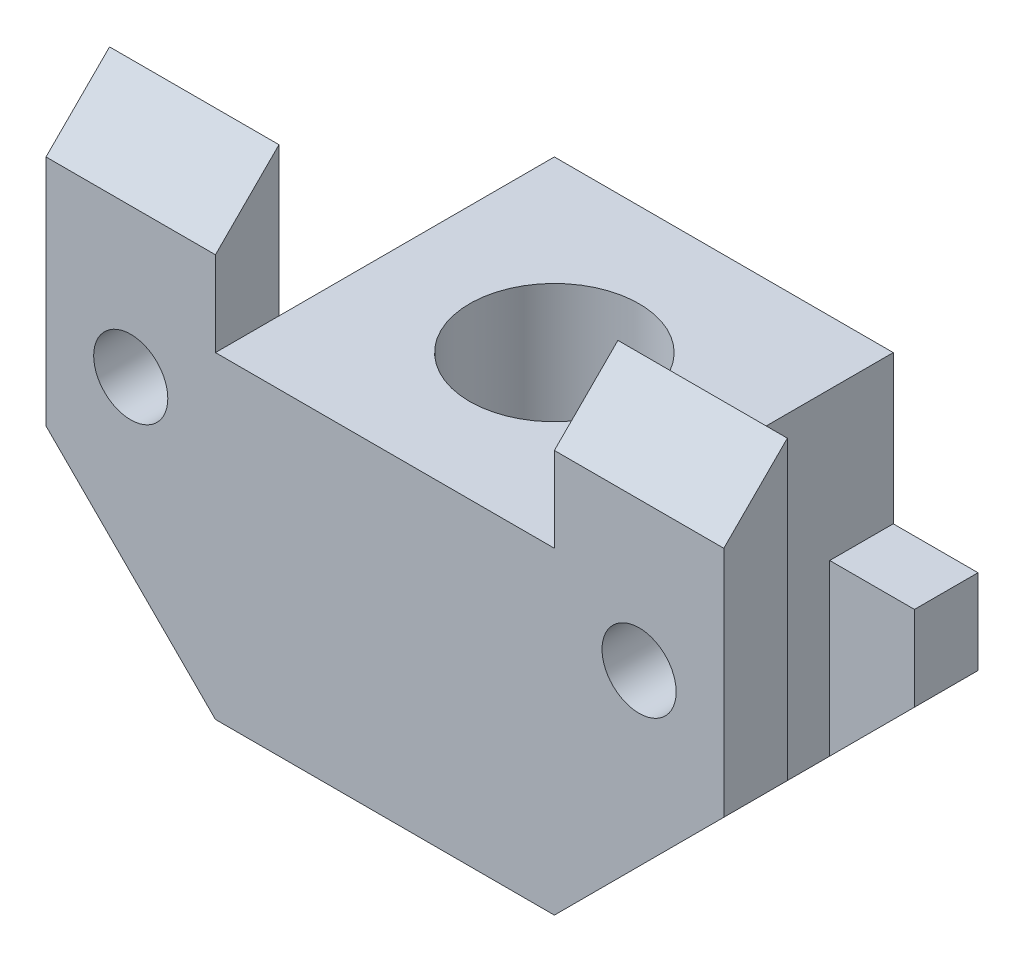
ISO-10303-21;
HEADER;
FILE_DESCRIPTION(('STEP AP214'),'2;1');
FILE_NAME('part.step','',(''),(''),'','','');
FILE_SCHEMA(('AUTOMOTIVE_DESIGN { 1 0 10303 214 1 1 1 1 }'));
ENDSEC;
DATA;
#1=APPLICATION_CONTEXT('core data for automotive mechanical design processes');
#2=APPLICATION_PROTOCOL_DEFINITION('international standard','automotive_design',2000,#1);
#3=PRODUCT_CONTEXT('',#1,'mechanical');
#4=PRODUCT('Part','Part','',(#3));
#5=PRODUCT_RELATED_PRODUCT_CATEGORY('part','',(#4));
#6=PRODUCT_DEFINITION_FORMATION('','',#4);
#7=PRODUCT_DEFINITION_CONTEXT('part definition',#1,'design');
#8=PRODUCT_DEFINITION('design','',#6,#7);
#9=PRODUCT_DEFINITION_SHAPE('','',#8);
#10=(LENGTH_UNIT() NAMED_UNIT(*) SI_UNIT(.MILLI.,.METRE.));
#11=(NAMED_UNIT(*) PLANE_ANGLE_UNIT() SI_UNIT($,.RADIAN.));
#12=(NAMED_UNIT(*) SI_UNIT($,.STERADIAN.) SOLID_ANGLE_UNIT());
#13=UNCERTAINTY_MEASURE_WITH_UNIT(LENGTH_MEASURE(1.E-05),#10,'distance_accuracy_value','');
#14=(GEOMETRIC_REPRESENTATION_CONTEXT(3) GLOBAL_UNCERTAINTY_ASSIGNED_CONTEXT((#13)) GLOBAL_UNIT_ASSIGNED_CONTEXT((#10,
#11,#12)) REPRESENTATION_CONTEXT('',''));
#15=CARTESIAN_POINT('',(0.,0.,0.));
#16=DIRECTION('',(0.,0.,1.));
#17=DIRECTION('',(1.,0.,0.));
#18=AXIS2_PLACEMENT_3D('',#15,#16,#17);
#19=CARTESIAN_POINT('',(0.,8.,0.));
#20=DIRECTION('',(0.,1.,0.));
#21=DIRECTION('',(0.,0.,1.));
#22=AXIS2_PLACEMENT_3D('',#19,#20,#21);
#23=PLANE('',#22);
#24=DIRECTION('',(1.,0.,0.));
#25=VECTOR('',#24,1.);
#26=CARTESIAN_POINT('',(16.,8.,-5.));
#27=LINE('',#26,#25);
#28=CARTESIAN_POINT('',(-12.,8.,-5.));
#29=VERTEX_POINT('',#28);
#30=CARTESIAN_POINT('',(-8.,8.,-5.));
#31=VERTEX_POINT('',#30);
#32=EDGE_CURVE('E208',#29,#31,#27,.T.);
#33=ORIENTED_EDGE('',*,*,#32,.T.);
#34=DIRECTION('',(0.,0.,1.));
#35=VECTOR('',#34,1.);
#36=CARTESIAN_POINT('',(-8.,8.,-5.));
#37=LINE('',#36,#35);
#38=CARTESIAN_POINT('',(-8.,8.,-8.));
#39=VERTEX_POINT('',#38);
#40=EDGE_CURVE('E198',#39,#31,#37,.T.);
#41=ORIENTED_EDGE('',*,*,#40,.F.);
#42=DIRECTION('',(-1.,0.,0.));
#43=VECTOR('',#42,1.);
#44=CARTESIAN_POINT('',(16.,8.,-8.));
#45=LINE('',#44,#43);
#46=CARTESIAN_POINT('',(-12.,8.,-8.));
#47=VERTEX_POINT('',#46);
#48=EDGE_CURVE('E204',#39,#47,#45,.T.);
#49=ORIENTED_EDGE('',*,*,#48,.T.);
#50=DIRECTION('',(0.,0.,-1.));
#51=VECTOR('',#50,1.);
#52=CARTESIAN_POINT('',(-12.,8.,8.001));
#53=LINE('',#52,#51);
#54=EDGE_CURVE('E212',#29,#47,#53,.T.);
#55=ORIENTED_EDGE('',*,*,#54,.F.);
#56=EDGE_LOOP('',(#33,#41,#49,#55));
#57=FACE_BOUND('',#56,.T.);
#58=ADVANCED_FACE('F41',(#57),#23,.T.);
#59=CARTESIAN_POINT('',(12.,8.,-8.));
#60=VERTEX_POINT('',#59);
#61=CARTESIAN_POINT('',(8.,8.,-8.));
#62=VERTEX_POINT('',#61);
#63=EDGE_CURVE('E180',#60,#62,#45,.T.);
#64=ORIENTED_EDGE('',*,*,#63,.T.);
#65=DIRECTION('',(0.,0.,-1.));
#66=VECTOR('',#65,1.);
#67=CARTESIAN_POINT('',(8.,8.,-5.));
#68=LINE('',#67,#66);
#69=CARTESIAN_POINT('',(8.,8.,-5.));
#70=VERTEX_POINT('',#69);
#71=EDGE_CURVE('E190',#70,#62,#68,.T.);
#72=ORIENTED_EDGE('',*,*,#71,.F.);
#73=CARTESIAN_POINT('',(12.,8.,-5.));
#74=VERTEX_POINT('',#73);
#75=EDGE_CURVE('E203',#70,#74,#27,.T.);
#76=ORIENTED_EDGE('',*,*,#75,.T.);
#77=DIRECTION('',(0.,0.,-1.));
#78=VECTOR('',#77,1.);
#79=CARTESIAN_POINT('',(12.,8.,8.001));
#80=LINE('',#79,#78);
#81=EDGE_CURVE('E201',#74,#60,#80,.T.);
#82=ORIENTED_EDGE('',*,*,#81,.T.);
#83=EDGE_LOOP('',(#64,#72,#76,#82));
#84=FACE_BOUND('',#83,.T.);
#85=ADVANCED_FACE('F200',(#84),#23,.T.);
#86=CARTESIAN_POINT('',(8.,15.,-5.));
#87=DIRECTION('',(0.,0.,-1.));
#88=DIRECTION('',(-1.,0.,0.));
#89=AXIS2_PLACEMENT_3D('',#86,#87,#88);
#90=PLANE('',#89);
#91=DIRECTION('',(0.707106781186549,0.707106781186546,0.));
#92=VECTOR('',#91,1.);
#93=CARTESIAN_POINT('',(16.,7.99999999999999,-5.));
#94=LINE('',#93,#92);
#95=CARTESIAN_POINT('',(8.,0.,-5.));
#96=VERTEX_POINT('',#95);
#97=CARTESIAN_POINT('',(12.,4.00000000000001,-5.));
#98=VERTEX_POINT('',#97);
#99=EDGE_CURVE('E352',#96,#98,#94,.T.);
#100=ORIENTED_EDGE('',*,*,#99,.T.);
#101=DIRECTION('',(0.,-1.,0.));
#102=VECTOR('',#101,1.);
#103=CARTESIAN_POINT('',(12.,4.,-5.));
#104=LINE('',#103,#102);
#105=EDGE_CURVE('E210',#74,#98,#104,.T.);
#106=ORIENTED_EDGE('',*,*,#105,.F.);
#107=ORIENTED_EDGE('',*,*,#75,.F.);
#108=DIRECTION('',(0.,-1.,0.));
#109=VECTOR('',#108,1.);
#110=CARTESIAN_POINT('',(8.,15.,-5.));
#111=LINE('',#110,#109);
#112=EDGE_CURVE('E193',#70,#96,#111,.T.);
#113=ORIENTED_EDGE('',*,*,#112,.T.);
#114=EDGE_LOOP('',(#100,#106,#107,#113));
#115=FACE_BOUND('',#114,.T.);
#116=ADVANCED_FACE('F442',(#115),#90,.F.);
#117=CARTESIAN_POINT('',(-16.,15.,-8.));
#118=DIRECTION('',(0.,0.,1.));
#119=DIRECTION('',(1.,0.,0.));
#120=AXIS2_PLACEMENT_3D('',#117,#118,#119);
#121=PLANE('',#120);
#122=ORIENTED_EDGE('',*,*,#63,.F.);
#123=DIRECTION('',(0.,1.,0.));
#124=VECTOR('',#123,1.);
#125=CARTESIAN_POINT('',(12.,4.,-8.));
#126=LINE('',#125,#124);
#127=CARTESIAN_POINT('',(12.,4.,-8.));
#128=VERTEX_POINT('',#127);
#129=EDGE_CURVE('E67',#128,#60,#126,.T.);
#130=ORIENTED_EDGE('',*,*,#129,.F.);
#131=DIRECTION('',(-0.707106781186549,-0.707106781186546,0.));
#132=VECTOR('',#131,1.);
#133=CARTESIAN_POINT('',(16.,7.99999999999999,-8.));
#134=LINE('',#133,#132);
#135=CARTESIAN_POINT('',(7.99999999999998,0.,-8.));
#136=VERTEX_POINT('',#135);
#137=EDGE_CURVE('E345',#128,#136,#134,.T.);
#138=ORIENTED_EDGE('',*,*,#137,.T.);
#139=DIRECTION('',(-1.,0.,0.));
#140=VECTOR('',#139,1.);
#141=CARTESIAN_POINT('',(-16.,0.,-8.));
#142=LINE('',#141,#140);
#143=CARTESIAN_POINT('',(-7.99999999999998,0.,-8.));
#144=VERTEX_POINT('',#143);
#145=EDGE_CURVE('E252',#136,#144,#142,.T.);
#146=ORIENTED_EDGE('',*,*,#145,.T.);
#147=DIRECTION('',(-0.707106781186549,0.707106781186546,0.));
#148=VECTOR('',#147,1.);
#149=CARTESIAN_POINT('',(-16.,7.99999999999999,-8.));
#150=LINE('',#149,#148);
#151=CARTESIAN_POINT('',(-12.,4.,-8.));
#152=VERTEX_POINT('',#151);
#153=EDGE_CURVE('E348',#144,#152,#150,.T.);
#154=ORIENTED_EDGE('',*,*,#153,.T.);
#155=DIRECTION('',(0.,-1.,0.));
#156=VECTOR('',#155,1.);
#157=CARTESIAN_POINT('',(-12.,4.,-8.));
#158=LINE('',#157,#156);
#159=EDGE_CURVE('E499',#47,#152,#158,.T.);
#160=ORIENTED_EDGE('',*,*,#159,.F.);
#161=ORIENTED_EDGE('',*,*,#48,.F.);
#162=DIRECTION('',(0.,-1.,0.));
#163=VECTOR('',#162,1.);
#164=CARTESIAN_POINT('',(-8.,31.2788205960997,-8.));
#165=LINE('',#164,#163);
#166=CARTESIAN_POINT('',(-8.,15.,-8.));
#167=VERTEX_POINT('',#166);
#168=EDGE_CURVE('E187',#167,#39,#165,.T.);
#169=ORIENTED_EDGE('',*,*,#168,.F.);
#170=DIRECTION('',(1.,0.,0.));
#171=VECTOR('',#170,1.);
#172=CARTESIAN_POINT('',(8.,15.,-8.));
#173=LINE('',#172,#171);
#174=CARTESIAN_POINT('',(8.,15.,-8.));
#175=VERTEX_POINT('',#174);
#176=EDGE_CURVE('E183',#167,#175,#173,.T.);
#177=ORIENTED_EDGE('',*,*,#176,.T.);
#178=DIRECTION('',(0.,-1.,0.));
#179=VECTOR('',#178,1.);
#180=CARTESIAN_POINT('',(8.,31.2788205960997,-8.));
#181=LINE('',#180,#179);
#182=EDGE_CURVE('E176',#175,#62,#181,.T.);
#183=ORIENTED_EDGE('',*,*,#182,.T.);
#184=EDGE_LOOP('',(#122,#130,#138,#146,#154,#160,#161,#169,#177,#183));
#185=FACE_BOUND('',#184,.T.);
#186=ADVANCED_FACE('F178',(#185),#121,.F.);
#187=CARTESIAN_POINT('',(-16.,15.,-5.));
#188=DIRECTION('',(0.,0.,-1.));
#189=DIRECTION('',(-1.,0.,0.));
#190=AXIS2_PLACEMENT_3D('',#187,#188,#189);
#191=PLANE('',#190);
#192=ORIENTED_EDGE('',*,*,#32,.F.);
#193=DIRECTION('',(0.,1.,0.));
#194=VECTOR('',#193,1.);
#195=CARTESIAN_POINT('',(-12.,4.,-5.));
#196=LINE('',#195,#194);
#197=CARTESIAN_POINT('',(-12.,4.,-5.));
#198=VERTEX_POINT('',#197);
#199=EDGE_CURVE('E59',#198,#29,#196,.T.);
#200=ORIENTED_EDGE('',*,*,#199,.F.);
#201=DIRECTION('',(0.707106781186549,-0.707106781186546,0.));
#202=VECTOR('',#201,1.);
#203=CARTESIAN_POINT('',(-16.,7.99999999999999,-5.));
#204=LINE('',#203,#202);
#205=CARTESIAN_POINT('',(-8.,0.,-5.));
#206=VERTEX_POINT('',#205);
#207=EDGE_CURVE('E342',#198,#206,#204,.T.);
#208=ORIENTED_EDGE('',*,*,#207,.T.);
#209=DIRECTION('',(0.,-1.,0.));
#210=VECTOR('',#209,1.);
#211=CARTESIAN_POINT('',(-8.,15.,-5.));
#212=LINE('',#211,#210);
#213=EDGE_CURVE('E304',#31,#206,#212,.T.);
#214=ORIENTED_EDGE('',*,*,#213,.F.);
#215=EDGE_LOOP('',(#192,#200,#208,#214));
#216=FACE_BOUND('',#215,.T.);
#217=ADVANCED_FACE('F455',(#216),#191,.F.);
#218=CARTESIAN_POINT('',(0.,15.,0.));
#219=DIRECTION('',(0.,-1.,0.));
#220=DIRECTION('',(0.,0.,-1.));
#221=AXIS2_PLACEMENT_3D('',#218,#219,#220);
#222=PLANE('',#221);
#223=CARTESIAN_POINT('',(0.,15.,0.));
#224=DIRECTION('',(0.,1.,0.));
#225=DIRECTION('',(0.,0.,1.));
#226=AXIS2_PLACEMENT_3D('',#223,#224,#225);
#227=CIRCLE('',#226,4.);
#228=CARTESIAN_POINT('',(0.,15.,4.));
#229=VERTEX_POINT('',#228);
#230=EDGE_CURVE('E248',#229,#229,#227,.T.);
#231=ORIENTED_EDGE('',*,*,#230,.F.);
#232=EDGE_LOOP('',(#231));
#233=FACE_BOUND('',#232,.T.);
#234=DIRECTION('',(0.,0.,-1.));
#235=VECTOR('',#234,1.);
#236=CARTESIAN_POINT('',(8.,15.,5.));
#237=LINE('',#236,#235);
#238=CARTESIAN_POINT('',(8.,15.,5.));
#239=VERTEX_POINT('',#238);
#240=EDGE_CURVE('E264',#239,#175,#237,.T.);
#241=ORIENTED_EDGE('',*,*,#240,.T.);
#242=ORIENTED_EDGE('',*,*,#176,.F.);
#243=DIRECTION('',(0.,0.,1.));
#244=VECTOR('',#243,1.);
#245=CARTESIAN_POINT('',(-8.,15.,5.));
#246=LINE('',#245,#244);
#247=CARTESIAN_POINT('',(-8.,15.,5.));
#248=VERTEX_POINT('',#247);
#249=EDGE_CURVE('E256',#167,#248,#246,.T.);
#250=ORIENTED_EDGE('',*,*,#249,.T.);
#251=DIRECTION('',(0.,0.,-1.));
#252=VECTOR('',#251,1.);
#253=CARTESIAN_POINT('',(-8.,15.,8.));
#254=LINE('',#253,#252);
#255=CARTESIAN_POINT('',(-8.,15.,8.));
#256=VERTEX_POINT('',#255);
#257=EDGE_CURVE('E217',#256,#248,#254,.T.);
#258=ORIENTED_EDGE('',*,*,#257,.F.);
#259=DIRECTION('',(1.,0.,0.));
#260=VECTOR('',#259,1.);
#261=CARTESIAN_POINT('',(-16.,15.,8.));
#262=LINE('',#261,#260);
#263=CARTESIAN_POINT('',(8.,15.,8.));
#264=VERTEX_POINT('',#263);
#265=EDGE_CURVE('E259',#256,#264,#262,.T.);
#266=ORIENTED_EDGE('',*,*,#265,.T.);
#267=DIRECTION('',(0.,0.,1.));
#268=VECTOR('',#267,1.);
#269=CARTESIAN_POINT('',(8.,15.,8.));
#270=LINE('',#269,#268);
#271=EDGE_CURVE('E232',#239,#264,#270,.T.);
#272=ORIENTED_EDGE('',*,*,#271,.F.);
#273=EDGE_LOOP('',(#241,#242,#250,#258,#266,#272));
#274=FACE_BOUND('',#273,.T.);
#275=ADVANCED_FACE('F391',(#233,#274),#222,.F.);
#276=CARTESIAN_POINT('',(0.,0.,0.));
#277=DIRECTION('',(0.,-1.,0.));
#278=DIRECTION('',(0.,0.,-1.));
#279=AXIS2_PLACEMENT_3D('',#276,#277,#278);
#280=PLANE('',#279);
#281=DIRECTION('',(0.,0.,-1.));
#282=VECTOR('',#281,1.);
#283=CARTESIAN_POINT('',(8.,0.,5.));
#284=LINE('',#283,#282);
#285=CARTESIAN_POINT('',(8.,0.,5.));
#286=VERTEX_POINT('',#285);
#287=EDGE_CURVE('E260',#286,#96,#284,.T.);
#288=ORIENTED_EDGE('',*,*,#287,.F.);
#289=DIRECTION('',(0.,0.,1.));
#290=VECTOR('',#289,1.);
#291=CARTESIAN_POINT('',(7.99999999999998,0.,8.));
#292=LINE('',#291,#290);
#293=CARTESIAN_POINT('',(7.99999999999998,0.,8.));
#294=VERTEX_POINT('',#293);
#295=EDGE_CURVE('E325',#286,#294,#292,.T.);
#296=ORIENTED_EDGE('',*,*,#295,.T.);
#297=DIRECTION('',(1.,0.,0.));
#298=VECTOR('',#297,1.);
#299=CARTESIAN_POINT('',(-16.,0.,8.));
#300=LINE('',#299,#298);
#301=CARTESIAN_POINT('',(-7.99999999999998,0.,8.));
#302=VERTEX_POINT('',#301);
#303=EDGE_CURVE('E274',#302,#294,#300,.T.);
#304=ORIENTED_EDGE('',*,*,#303,.F.);
#305=DIRECTION('',(0.,0.,-1.));
#306=VECTOR('',#305,1.);
#307=CARTESIAN_POINT('',(-7.99999999999998,0.,5.));
#308=LINE('',#307,#306);
#309=CARTESIAN_POINT('',(-8.,0.,5.));
#310=VERTEX_POINT('',#309);
#311=EDGE_CURVE('E322',#302,#310,#308,.T.);
#312=ORIENTED_EDGE('',*,*,#311,.T.);
#313=DIRECTION('',(0.,0.,1.));
#314=VECTOR('',#313,1.);
#315=CARTESIAN_POINT('',(-8.,0.,5.));
#316=LINE('',#315,#314);
#317=EDGE_CURVE('E270',#206,#310,#316,.T.);
#318=ORIENTED_EDGE('',*,*,#317,.F.);
#319=DIRECTION('',(0.,0.,-1.));
#320=VECTOR('',#319,1.);
#321=CARTESIAN_POINT('',(-7.99999999999998,0.,-7.99999999999999));
#322=LINE('',#321,#320);
#323=EDGE_CURVE('E319',#206,#144,#322,.T.);
#324=ORIENTED_EDGE('',*,*,#323,.T.);
#325=ORIENTED_EDGE('',*,*,#145,.F.);
#326=DIRECTION('',(0.,0.,1.));
#327=VECTOR('',#326,1.);
#328=CARTESIAN_POINT('',(7.99999999999998,0.,-4.99999999999999));
#329=LINE('',#328,#327);
#330=EDGE_CURVE('E315',#136,#96,#329,.T.);
#331=ORIENTED_EDGE('',*,*,#330,.T.);
#332=EDGE_LOOP('',(#288,#296,#304,#312,#318,#324,#325,#331));
#333=FACE_BOUND('',#332,.T.);
#334=CARTESIAN_POINT('',(0.,0.,0.));
#335=DIRECTION('',(0.,1.,0.));
#336=DIRECTION('',(0.,0.,1.));
#337=AXIS2_PLACEMENT_3D('',#334,#335,#336);
#338=CIRCLE('',#337,4.);
#339=CARTESIAN_POINT('',(0.,0.,4.));
#340=VERTEX_POINT('',#339);
#341=EDGE_CURVE('E247',#340,#340,#338,.T.);
#342=ORIENTED_EDGE('',*,*,#341,.T.);
#343=EDGE_LOOP('',(#342));
#344=FACE_BOUND('',#343,.T.);
#345=ADVANCED_FACE('F416',(#333,#344),#280,.T.);
#346=CARTESIAN_POINT('',(-8.,15.,5.));
#347=DIRECTION('',(1.,0.,0.));
#348=DIRECTION('',(0.,0.,-1.));
#349=AXIS2_PLACEMENT_3D('',#346,#347,#348);
#350=PLANE('',#349);
#351=ORIENTED_EDGE('',*,*,#317,.T.);
#352=DIRECTION('',(0.,-1.,0.));
#353=VECTOR('',#352,1.);
#354=CARTESIAN_POINT('',(-8.,15.,5.));
#355=LINE('',#354,#353);
#356=EDGE_CURVE('E300',#248,#310,#355,.T.);
#357=ORIENTED_EDGE('',*,*,#356,.F.);
#358=ORIENTED_EDGE('',*,*,#249,.F.);
#359=ORIENTED_EDGE('',*,*,#168,.T.);
#360=ORIENTED_EDGE('',*,*,#40,.T.);
#361=ORIENTED_EDGE('',*,*,#213,.T.);
#362=EDGE_LOOP('',(#351,#357,#358,#359,#360,#361));
#363=FACE_BOUND('',#362,.T.);
#364=ADVANCED_FACE('F459',(#363),#350,.F.);
#365=CARTESIAN_POINT('',(-16.,15.,5.));
#366=DIRECTION('',(0.,0.,1.));
#367=DIRECTION('',(1.,0.,0.));
#368=AXIS2_PLACEMENT_3D('',#365,#366,#367);
#369=PLANE('',#368);
#370=CARTESIAN_POINT('',(-12.,12.,5.));
#371=DIRECTION('',(0.,0.,1.));
#372=DIRECTION('',(1.,0.,0.));
#373=AXIS2_PLACEMENT_3D('',#370,#371,#372);
#374=CIRCLE('',#373,1.75);
#375=CARTESIAN_POINT('',(-10.25,12.,5.));
#376=VERTEX_POINT('',#375);
#377=EDGE_CURVE('E511',#376,#376,#374,.T.);
#378=ORIENTED_EDGE('',*,*,#377,.T.);
#379=EDGE_LOOP('',(#378));
#380=FACE_BOUND('',#379,.T.);
#381=ORIENTED_EDGE('',*,*,#356,.T.);
#382=DIRECTION('',(-0.707106781186549,0.707106781186546,0.));
#383=VECTOR('',#382,1.);
#384=CARTESIAN_POINT('',(-16.,7.99999999999999,5.));
#385=LINE('',#384,#383);
#386=CARTESIAN_POINT('',(-16.,7.99999999999999,5.));
#387=VERTEX_POINT('',#386);
#388=EDGE_CURVE('E339',#310,#387,#385,.T.);
#389=ORIENTED_EDGE('',*,*,#388,.T.);
#390=DIRECTION('',(0.,-1.,0.));
#391=VECTOR('',#390,1.);
#392=CARTESIAN_POINT('',(-16.,15.,5.));
#393=LINE('',#392,#391);
#394=CARTESIAN_POINT('',(-16.,22.,5.));
#395=VERTEX_POINT('',#394);
#396=EDGE_CURVE('E296',#395,#387,#393,.T.);
#397=ORIENTED_EDGE('',*,*,#396,.F.);
#398=DIRECTION('',(-1.,0.,0.));
#399=VECTOR('',#398,1.);
#400=CARTESIAN_POINT('',(-16.,22.,5.));
#401=LINE('',#400,#399);
#402=CARTESIAN_POINT('',(-8.,22.,5.));
#403=VERTEX_POINT('',#402);
#404=EDGE_CURVE('E218',#403,#395,#401,.T.);
#405=ORIENTED_EDGE('',*,*,#404,.F.);
#406=DIRECTION('',(0.,-1.,0.));
#407=VECTOR('',#406,1.);
#408=CARTESIAN_POINT('',(-8.,22.,5.));
#409=LINE('',#408,#407);
#410=EDGE_CURVE('E222',#403,#248,#409,.T.);
#411=ORIENTED_EDGE('',*,*,#410,.T.);
#412=EDGE_LOOP('',(#381,#389,#397,#405,#411));
#413=FACE_BOUND('',#412,.T.);
#414=ADVANCED_FACE('F407',(#380,#413),#369,.F.);
#415=CARTESIAN_POINT('',(-16.,15.,8.));
#416=DIRECTION('',(1.,0.,0.));
#417=DIRECTION('',(0.,0.,-1.));
#418=AXIS2_PLACEMENT_3D('',#415,#416,#417);
#419=PLANE('',#418);
#420=DIRECTION('',(0.,-1.,0.));
#421=VECTOR('',#420,1.);
#422=CARTESIAN_POINT('',(-16.,15.,8.));
#423=LINE('',#422,#421);
#424=CARTESIAN_POINT('',(-16.,19.,8.));
#425=VERTEX_POINT('',#424);
#426=CARTESIAN_POINT('',(-16.,7.99999999999999,8.));
#427=VERTEX_POINT('',#426);
#428=EDGE_CURVE('E293',#425,#427,#423,.T.);
#429=ORIENTED_EDGE('',*,*,#428,.F.);
#430=DIRECTION('',(0.,-0.707106781186549,0.707106781186546));
#431=VECTOR('',#430,1.);
#432=CARTESIAN_POINT('',(-16.,22.,5.));
#433=LINE('',#432,#431);
#434=EDGE_CURVE('E365',#425,#395,#433,.F.);
#435=ORIENTED_EDGE('',*,*,#434,.T.);
#436=ORIENTED_EDGE('',*,*,#396,.T.);
#437=DIRECTION('',(0.,0.,1.));
#438=VECTOR('',#437,1.);
#439=CARTESIAN_POINT('',(-16.,7.99999999999999,8.));
#440=LINE('',#439,#438);
#441=EDGE_CURVE('E335',#387,#427,#440,.T.);
#442=ORIENTED_EDGE('',*,*,#441,.T.);
#443=EDGE_LOOP('',(#429,#435,#436,#442));
#444=FACE_BOUND('',#443,.T.);
#445=ADVANCED_FACE('F404',(#444),#419,.F.);
#446=CARTESIAN_POINT('',(-16.,15.,8.));
#447=DIRECTION('',(0.,0.,-1.));
#448=DIRECTION('',(-1.,0.,0.));
#449=AXIS2_PLACEMENT_3D('',#446,#447,#448);
#450=PLANE('',#449);
#451=CARTESIAN_POINT('',(12.,12.,8.));
#452=DIRECTION('',(0.,0.,1.));
#453=DIRECTION('',(1.,0.,0.));
#454=AXIS2_PLACEMENT_3D('',#451,#452,#453);
#455=CIRCLE('',#454,1.75);
#456=CARTESIAN_POINT('',(13.75,12.,8.));
#457=VERTEX_POINT('',#456);
#458=EDGE_CURVE('E519',#457,#457,#455,.T.);
#459=ORIENTED_EDGE('',*,*,#458,.F.);
#460=EDGE_LOOP('',(#459));
#461=FACE_BOUND('',#460,.T.);
#462=CARTESIAN_POINT('',(-12.,12.,8.));
#463=DIRECTION('',(0.,0.,1.));
#464=DIRECTION('',(-1.,0.,0.));
#465=AXIS2_PLACEMENT_3D('',#462,#463,#464);
#466=CIRCLE('',#465,1.75);
#467=CARTESIAN_POINT('',(-13.75,12.,8.));
#468=VERTEX_POINT('',#467);
#469=EDGE_CURVE('E522',#468,#468,#466,.T.);
#470=ORIENTED_EDGE('',*,*,#469,.F.);
#471=EDGE_LOOP('',(#470));
#472=FACE_BOUND('',#471,.T.);
#473=DIRECTION('',(0.,-1.,0.));
#474=VECTOR('',#473,1.);
#475=CARTESIAN_POINT('',(-8.,22.,8.));
#476=LINE('',#475,#474);
#477=CARTESIAN_POINT('',(-8.,19.,8.));
#478=VERTEX_POINT('',#477);
#479=EDGE_CURVE('E229',#478,#256,#476,.T.);
#480=ORIENTED_EDGE('',*,*,#479,.F.);
#481=DIRECTION('',(-1.,0.,0.));
#482=VECTOR('',#481,1.);
#483=CARTESIAN_POINT('',(-16.,19.,8.));
#484=LINE('',#483,#482);
#485=EDGE_CURVE('E362',#478,#425,#484,.T.);
#486=ORIENTED_EDGE('',*,*,#485,.T.);
#487=ORIENTED_EDGE('',*,*,#428,.T.);
#488=DIRECTION('',(0.707106781186549,-0.707106781186546,0.));
#489=VECTOR('',#488,1.);
#490=CARTESIAN_POINT('',(-16.,7.99999999999999,8.));
#491=LINE('',#490,#489);
#492=EDGE_CURVE('E328',#427,#302,#491,.T.);
#493=ORIENTED_EDGE('',*,*,#492,.T.);
#494=ORIENTED_EDGE('',*,*,#303,.T.);
#495=DIRECTION('',(0.707106781186549,0.707106781186546,0.));
#496=VECTOR('',#495,1.);
#497=CARTESIAN_POINT('',(16.,7.99999999999999,8.));
#498=LINE('',#497,#496);
#499=CARTESIAN_POINT('',(16.,7.99999999999999,8.));
#500=VERTEX_POINT('',#499);
#501=EDGE_CURVE('E331',#294,#500,#498,.T.);
#502=ORIENTED_EDGE('',*,*,#501,.T.);
#503=DIRECTION('',(0.,-1.,0.));
#504=VECTOR('',#503,1.);
#505=CARTESIAN_POINT('',(16.,15.,8.));
#506=LINE('',#505,#504);
#507=CARTESIAN_POINT('',(16.,19.,8.));
#508=VERTEX_POINT('',#507);
#509=EDGE_CURVE('E290',#508,#500,#506,.T.);
#510=ORIENTED_EDGE('',*,*,#509,.F.);
#511=DIRECTION('',(-1.,0.,0.));
#512=VECTOR('',#511,1.);
#513=CARTESIAN_POINT('',(8.,19.,8.));
#514=LINE('',#513,#512);
#515=CARTESIAN_POINT('',(8.,19.,8.));
#516=VERTEX_POINT('',#515);
#517=EDGE_CURVE('E359',#508,#516,#514,.T.);
#518=ORIENTED_EDGE('',*,*,#517,.T.);
#519=DIRECTION('',(0.,-1.,0.));
#520=VECTOR('',#519,1.);
#521=CARTESIAN_POINT('',(8.,22.,8.));
#522=LINE('',#521,#520);
#523=EDGE_CURVE('E237',#516,#264,#522,.T.);
#524=ORIENTED_EDGE('',*,*,#523,.T.);
#525=ORIENTED_EDGE('',*,*,#265,.F.);
#526=EDGE_LOOP('',(#480,#486,#487,#493,#494,#502,#510,#518,#524,#525));
#527=FACE_BOUND('',#526,.T.);
#528=ADVANCED_FACE('F378',(#461,#472,#527),#450,.F.);
#529=CARTESIAN_POINT('',(16.,15.,8.));
#530=DIRECTION('',(-1.,0.,0.));
#531=DIRECTION('',(0.,0.,1.));
#532=AXIS2_PLACEMENT_3D('',#529,#530,#531);
#533=PLANE('',#532);
#534=DIRECTION('',(0.,-1.,0.));
#535=VECTOR('',#534,1.);
#536=CARTESIAN_POINT('',(16.,15.,5.));
#537=LINE('',#536,#535);
#538=CARTESIAN_POINT('',(16.,22.,5.));
#539=VERTEX_POINT('',#538);
#540=CARTESIAN_POINT('',(16.,7.99999999999999,5.));
#541=VERTEX_POINT('',#540);
#542=EDGE_CURVE('E286',#539,#541,#537,.T.);
#543=ORIENTED_EDGE('',*,*,#542,.F.);
#544=DIRECTION('',(0.,-0.707106781186549,0.707106781186546));
#545=VECTOR('',#544,1.);
#546=CARTESIAN_POINT('',(16.,22.,5.));
#547=LINE('',#546,#545);
#548=EDGE_CURVE('E52',#539,#508,#547,.T.);
#549=ORIENTED_EDGE('',*,*,#548,.T.);
#550=ORIENTED_EDGE('',*,*,#509,.T.);
#551=DIRECTION('',(0.,0.,-1.));
#552=VECTOR('',#551,1.);
#553=CARTESIAN_POINT('',(16.,7.99999999999999,5.));
#554=LINE('',#553,#552);
#555=EDGE_CURVE('E308',#500,#541,#554,.T.);
#556=ORIENTED_EDGE('',*,*,#555,.T.);
#557=EDGE_LOOP('',(#543,#549,#550,#556));
#558=FACE_BOUND('',#557,.T.);
#559=ADVANCED_FACE('F372',(#558),#533,.F.);
#560=CARTESIAN_POINT('',(8.,15.,5.));
#561=DIRECTION('',(0.,0.,1.));
#562=DIRECTION('',(1.,0.,0.));
#563=AXIS2_PLACEMENT_3D('',#560,#561,#562);
#564=PLANE('',#563);
#565=CARTESIAN_POINT('',(12.,12.,5.));
#566=DIRECTION('',(0.,0.,1.));
#567=DIRECTION('',(1.,0.,0.));
#568=AXIS2_PLACEMENT_3D('',#565,#566,#567);
#569=CIRCLE('',#568,1.75);
#570=CARTESIAN_POINT('',(13.75,12.,5.));
#571=VERTEX_POINT('',#570);
#572=EDGE_CURVE('E46',#571,#571,#569,.T.);
#573=ORIENTED_EDGE('',*,*,#572,.T.);
#574=EDGE_LOOP('',(#573));
#575=FACE_BOUND('',#574,.T.);
#576=ORIENTED_EDGE('',*,*,#542,.T.);
#577=DIRECTION('',(-0.707106781186549,-0.707106781186546,0.));
#578=VECTOR('',#577,1.);
#579=CARTESIAN_POINT('',(16.,7.99999999999999,5.));
#580=LINE('',#579,#578);
#581=EDGE_CURVE('E312',#541,#286,#580,.T.);
#582=ORIENTED_EDGE('',*,*,#581,.T.);
#583=DIRECTION('',(0.,-1.,0.));
#584=VECTOR('',#583,1.);
#585=CARTESIAN_POINT('',(8.,15.,5.));
#586=LINE('',#585,#584);
#587=EDGE_CURVE('E282',#239,#286,#586,.T.);
#588=ORIENTED_EDGE('',*,*,#587,.F.);
#589=DIRECTION('',(0.,-1.,0.));
#590=VECTOR('',#589,1.);
#591=CARTESIAN_POINT('',(8.,22.,5.));
#592=LINE('',#591,#590);
#593=CARTESIAN_POINT('',(8.,22.,5.));
#594=VERTEX_POINT('',#593);
#595=EDGE_CURVE('E243',#594,#239,#592,.T.);
#596=ORIENTED_EDGE('',*,*,#595,.F.);
#597=DIRECTION('',(-1.,0.,0.));
#598=VECTOR('',#597,1.);
#599=CARTESIAN_POINT('',(16.,22.,5.));
#600=LINE('',#599,#598);
#601=EDGE_CURVE('E233',#539,#594,#600,.T.);
#602=ORIENTED_EDGE('',*,*,#601,.F.);
#603=EDGE_LOOP('',(#576,#582,#588,#596,#602));
#604=FACE_BOUND('',#603,.T.);
#605=ADVANCED_FACE('F388',(#575,#604),#564,.F.);
#606=CARTESIAN_POINT('',(8.,15.,5.));
#607=DIRECTION('',(-1.,0.,0.));
#608=DIRECTION('',(0.,0.,1.));
#609=AXIS2_PLACEMENT_3D('',#606,#607,#608);
#610=PLANE('',#609);
#611=ORIENTED_EDGE('',*,*,#287,.T.);
#612=ORIENTED_EDGE('',*,*,#112,.F.);
#613=ORIENTED_EDGE('',*,*,#71,.T.);
#614=ORIENTED_EDGE('',*,*,#182,.F.);
#615=ORIENTED_EDGE('',*,*,#240,.F.);
#616=ORIENTED_EDGE('',*,*,#587,.T.);
#617=EDGE_LOOP('',(#611,#612,#613,#614,#615,#616));
#618=FACE_BOUND('',#617,.T.);
#619=ADVANCED_FACE('F192',(#618),#610,.F.);
#620=CARTESIAN_POINT('',(0.,15.,0.));
#621=DIRECTION('',(0.,-1.,0.));
#622=DIRECTION('',(0.,0.,-1.));
#623=AXIS2_PLACEMENT_3D('',#620,#621,#622);
#624=CYLINDRICAL_SURFACE('',#623,4.);
#625=ORIENTED_EDGE('',*,*,#230,.T.);
#626=EDGE_LOOP('',(#625));
#627=FACE_BOUND('',#626,.T.);
#628=ORIENTED_EDGE('',*,*,#341,.F.);
#629=EDGE_LOOP('',(#628));
#630=FACE_BOUND('',#629,.T.);
#631=ADVANCED_FACE('F423',(#627,#630),#624,.F.);
#632=CARTESIAN_POINT('',(16.,7.99999999999999,8.));
#633=DIRECTION('',(0.707106781186546,-0.707106781186549,0.));
#634=DIRECTION('',(0.,0.,1.));
#635=AXIS2_PLACEMENT_3D('',#632,#633,#634);
#636=PLANE('',#635);
#637=ORIENTED_EDGE('',*,*,#501,.F.);
#638=ORIENTED_EDGE('',*,*,#295,.F.);
#639=ORIENTED_EDGE('',*,*,#581,.F.);
#640=ORIENTED_EDGE('',*,*,#555,.F.);
#641=EDGE_LOOP('',(#637,#638,#639,#640));
#642=FACE_BOUND('',#641,.T.);
#643=ADVANCED_FACE('F421',(#642),#636,.T.);
#644=CARTESIAN_POINT('',(-16.,7.99999999999999,8.));
#645=DIRECTION('',(-0.707106781186546,-0.707106781186549,0.));
#646=DIRECTION('',(0.,0.,-1.));
#647=AXIS2_PLACEMENT_3D('',#644,#645,#646);
#648=PLANE('',#647);
#649=ORIENTED_EDGE('',*,*,#388,.F.);
#650=ORIENTED_EDGE('',*,*,#311,.F.);
#651=ORIENTED_EDGE('',*,*,#492,.F.);
#652=ORIENTED_EDGE('',*,*,#441,.F.);
#653=EDGE_LOOP('',(#649,#650,#651,#652));
#654=FACE_BOUND('',#653,.T.);
#655=ADVANCED_FACE('F412',(#654),#648,.T.);
#656=CARTESIAN_POINT('',(-16.,7.99999999999999,-8.));
#657=DIRECTION('',(-0.707106781186546,-0.707106781186549,0.));
#658=DIRECTION('',(0.,0.,-1.));
#659=AXIS2_PLACEMENT_3D('',#656,#657,#658);
#660=PLANE('',#659);
#661=DIRECTION('',(0.,0.,-1.));
#662=VECTOR('',#661,1.);
#663=CARTESIAN_POINT('',(-12.,4.,8.001));
#664=LINE('',#663,#662);
#665=EDGE_CURVE('E504',#198,#152,#664,.T.);
#666=ORIENTED_EDGE('',*,*,#665,.T.);
#667=ORIENTED_EDGE('',*,*,#153,.F.);
#668=ORIENTED_EDGE('',*,*,#323,.F.);
#669=ORIENTED_EDGE('',*,*,#207,.F.);
#670=EDGE_LOOP('',(#666,#667,#668,#669));
#671=FACE_BOUND('',#670,.T.);
#672=ADVANCED_FACE('F429',(#671),#660,.T.);
#673=CARTESIAN_POINT('',(16.,7.99999999999999,-8.));
#674=DIRECTION('',(0.707106781186546,-0.707106781186549,0.));
#675=DIRECTION('',(0.,0.,1.));
#676=AXIS2_PLACEMENT_3D('',#673,#674,#675);
#677=PLANE('',#676);
#678=DIRECTION('',(0.,0.,-1.));
#679=VECTOR('',#678,1.);
#680=CARTESIAN_POINT('',(12.,4.,8.001));
#681=LINE('',#680,#679);
#682=EDGE_CURVE('E493',#98,#128,#681,.T.);
#683=ORIENTED_EDGE('',*,*,#682,.F.);
#684=ORIENTED_EDGE('',*,*,#99,.F.);
#685=ORIENTED_EDGE('',*,*,#330,.F.);
#686=ORIENTED_EDGE('',*,*,#137,.F.);
#687=EDGE_LOOP('',(#683,#684,#685,#686));
#688=FACE_BOUND('',#687,.T.);
#689=ADVANCED_FACE('F451',(#688),#677,.T.);
#690=CARTESIAN_POINT('',(8.,22.,8.));
#691=DIRECTION('',(1.,0.,0.));
#692=DIRECTION('',(0.,0.,-1.));
#693=AXIS2_PLACEMENT_3D('',#690,#691,#692);
#694=PLANE('',#693);
#695=ORIENTED_EDGE('',*,*,#523,.F.);
#696=DIRECTION('',(0.,0.707106781186549,-0.707106781186546));
#697=VECTOR('',#696,1.);
#698=CARTESIAN_POINT('',(8.,22.,5.));
#699=LINE('',#698,#697);
#700=EDGE_CURVE('E11',#516,#594,#699,.T.);
#701=ORIENTED_EDGE('',*,*,#700,.T.);
#702=ORIENTED_EDGE('',*,*,#595,.T.);
#703=ORIENTED_EDGE('',*,*,#271,.T.);
#704=EDGE_LOOP('',(#695,#701,#702,#703));
#705=FACE_BOUND('',#704,.T.);
#706=ADVANCED_FACE('F385',(#705),#694,.F.);
#707=CARTESIAN_POINT('',(-8.,22.,8.));
#708=DIRECTION('',(-1.,0.,0.));
#709=DIRECTION('',(0.,0.,1.));
#710=AXIS2_PLACEMENT_3D('',#707,#708,#709);
#711=PLANE('',#710);
#712=ORIENTED_EDGE('',*,*,#410,.F.);
#713=DIRECTION('',(0.,0.707106781186549,-0.707106781186546));
#714=VECTOR('',#713,1.);
#715=CARTESIAN_POINT('',(-8.,22.,5.));
#716=LINE('',#715,#714);
#717=EDGE_CURVE('E356',#403,#478,#716,.F.);
#718=ORIENTED_EDGE('',*,*,#717,.T.);
#719=ORIENTED_EDGE('',*,*,#479,.T.);
#720=ORIENTED_EDGE('',*,*,#257,.T.);
#721=EDGE_LOOP('',(#712,#718,#719,#720));
#722=FACE_BOUND('',#721,.T.);
#723=ADVANCED_FACE('F447',(#722),#711,.F.);
#724=CARTESIAN_POINT('',(0.,22.,5.));
#725=DIRECTION('',(0.,-0.707106781186546,-0.707106781186549));
#726=DIRECTION('',(1.,0.,0.));
#727=AXIS2_PLACEMENT_3D('',#724,#725,#726);
#728=PLANE('',#727);
#729=ORIENTED_EDGE('',*,*,#434,.F.);
#730=ORIENTED_EDGE('',*,*,#485,.F.);
#731=ORIENTED_EDGE('',*,*,#717,.F.);
#732=ORIENTED_EDGE('',*,*,#404,.T.);
#733=EDGE_LOOP('',(#729,#730,#731,#732));
#734=FACE_BOUND('',#733,.T.);
#735=ADVANCED_FACE('F399',(#734),#728,.F.);
#736=CARTESIAN_POINT('',(0.,22.,5.));
#737=DIRECTION('',(0.,0.707106781186546,0.707106781186549));
#738=DIRECTION('',(-1.,0.,0.));
#739=AXIS2_PLACEMENT_3D('',#736,#737,#738);
#740=PLANE('',#739);
#741=ORIENTED_EDGE('',*,*,#700,.F.);
#742=ORIENTED_EDGE('',*,*,#517,.F.);
#743=ORIENTED_EDGE('',*,*,#548,.F.);
#744=ORIENTED_EDGE('',*,*,#601,.T.);
#745=EDGE_LOOP('',(#741,#742,#743,#744));
#746=FACE_BOUND('',#745,.T.);
#747=ADVANCED_FACE('F44',(#746),#740,.T.);
#748=CARTESIAN_POINT('',(-12.,4.,8.001));
#749=DIRECTION('',(1.,0.,0.));
#750=DIRECTION('',(0.,0.,-1.));
#751=AXIS2_PLACEMENT_3D('',#748,#749,#750);
#752=PLANE('',#751);
#753=ORIENTED_EDGE('',*,*,#199,.T.);
#754=ORIENTED_EDGE('',*,*,#54,.T.);
#755=ORIENTED_EDGE('',*,*,#159,.T.);
#756=ORIENTED_EDGE('',*,*,#665,.F.);
#757=EDGE_LOOP('',(#753,#754,#755,#756));
#758=FACE_BOUND('',#757,.T.);
#759=ADVANCED_FACE('F445',(#758),#752,.F.);
#760=CARTESIAN_POINT('',(12.,4.,8.001));
#761=DIRECTION('',(-1.,0.,0.));
#762=DIRECTION('',(0.,0.,1.));
#763=AXIS2_PLACEMENT_3D('',#760,#761,#762);
#764=PLANE('',#763);
#765=ORIENTED_EDGE('',*,*,#105,.T.);
#766=ORIENTED_EDGE('',*,*,#682,.T.);
#767=ORIENTED_EDGE('',*,*,#129,.T.);
#768=ORIENTED_EDGE('',*,*,#81,.F.);
#769=EDGE_LOOP('',(#765,#766,#767,#768));
#770=FACE_BOUND('',#769,.T.);
#771=ADVANCED_FACE('F526',(#770),#764,.F.);
#772=CARTESIAN_POINT('',(12.,12.,-8.));
#773=DIRECTION('',(0.,0.,1.));
#774=DIRECTION('',(1.,0.,0.));
#775=AXIS2_PLACEMENT_3D('',#772,#773,#774);
#776=CYLINDRICAL_SURFACE('',#775,1.75);
#777=ORIENTED_EDGE('',*,*,#458,.T.);
#778=EDGE_LOOP('',(#777));
#779=FACE_BOUND('',#778,.T.);
#780=ORIENTED_EDGE('',*,*,#572,.F.);
#781=EDGE_LOOP('',(#780));
#782=FACE_BOUND('',#781,.T.);
#783=ADVANCED_FACE('F528',(#779,#782),#776,.F.);
#784=CARTESIAN_POINT('',(-12.,12.,-8.));
#785=DIRECTION('',(0.,0.,1.));
#786=DIRECTION('',(1.,0.,0.));
#787=AXIS2_PLACEMENT_3D('',#784,#785,#786);
#788=CYLINDRICAL_SURFACE('',#787,1.75);
#789=ORIENTED_EDGE('',*,*,#469,.T.);
#790=EDGE_LOOP('',(#789));
#791=FACE_BOUND('',#790,.T.);
#792=ORIENTED_EDGE('',*,*,#377,.F.);
#793=EDGE_LOOP('',(#792));
#794=FACE_BOUND('',#793,.T.);
#795=ADVANCED_FACE('F534',(#791,#794),#788,.F.);
#796=CLOSED_SHELL('',(#58,#85,#116,#186,#217,#275,#345,#364,#414,#445,#528,#559,#605,#619,#631,
#643,#655,#672,#689,#706,#723,#735,#747,#759,#771,#783,#795));
#797=MANIFOLD_SOLID_BREP('B2',#796);
#798=ADVANCED_BREP_SHAPE_REPRESENTATION('',(#18,#797),#14);
#799=SHAPE_DEFINITION_REPRESENTATION(#9,#798);
ENDSEC;
END-ISO-10303-21;
